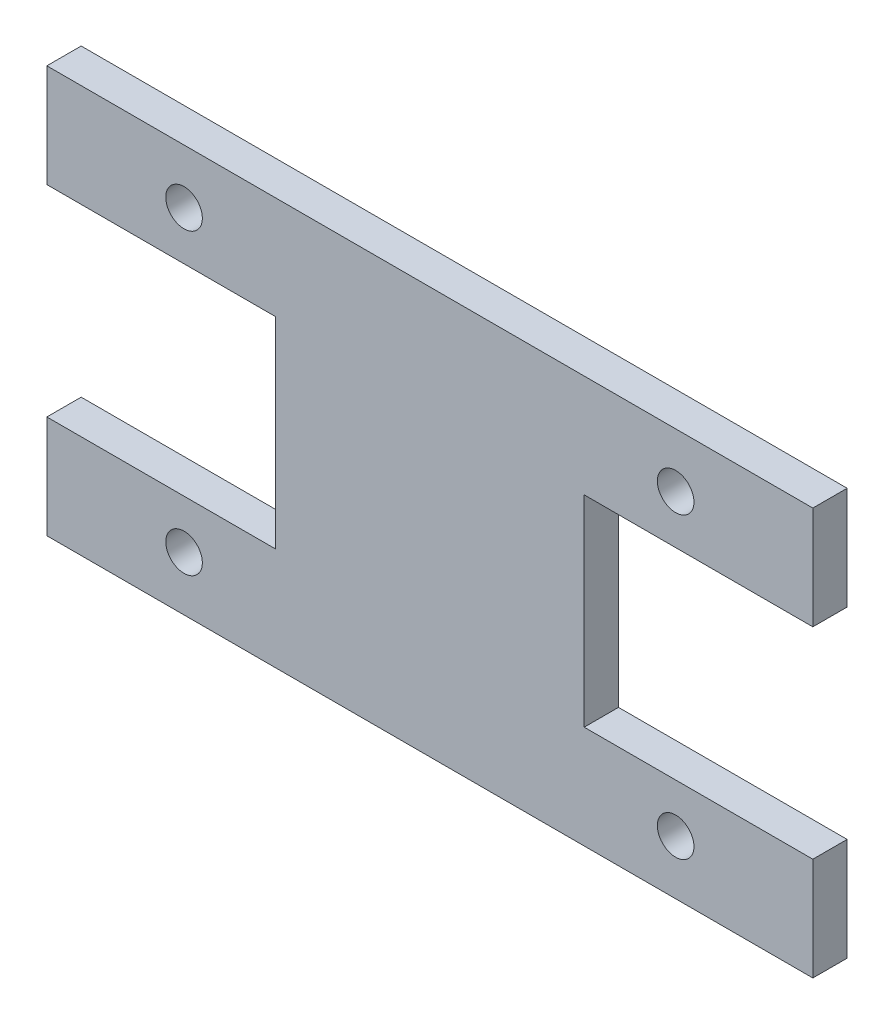
ISO-10303-21;
HEADER;
FILE_DESCRIPTION(('STEP AP214'),'2;1');
FILE_NAME('part.step','',(''),(''),'','','');
FILE_SCHEMA(('AUTOMOTIVE_DESIGN { 1 0 10303 214 1 1 1 1 }'));
ENDSEC;
DATA;
#1=APPLICATION_CONTEXT('core data for automotive mechanical design processes');
#2=APPLICATION_PROTOCOL_DEFINITION('international standard','automotive_design',2000,#1);
#3=PRODUCT_CONTEXT('',#1,'mechanical');
#4=PRODUCT('Part','Part','',(#3));
#5=PRODUCT_RELATED_PRODUCT_CATEGORY('part','',(#4));
#6=PRODUCT_DEFINITION_FORMATION('','',#4);
#7=PRODUCT_DEFINITION_CONTEXT('part definition',#1,'design');
#8=PRODUCT_DEFINITION('design','',#6,#7);
#9=PRODUCT_DEFINITION_SHAPE('','',#8);
#10=(LENGTH_UNIT() NAMED_UNIT(*) SI_UNIT(.MILLI.,.METRE.));
#11=(NAMED_UNIT(*) PLANE_ANGLE_UNIT() SI_UNIT($,.RADIAN.));
#12=(NAMED_UNIT(*) SI_UNIT($,.STERADIAN.) SOLID_ANGLE_UNIT());
#13=UNCERTAINTY_MEASURE_WITH_UNIT(LENGTH_MEASURE(1.E-05),#10,'distance_accuracy_value','');
#14=(GEOMETRIC_REPRESENTATION_CONTEXT(3) GLOBAL_UNCERTAINTY_ASSIGNED_CONTEXT((#13)) GLOBAL_UNIT_ASSIGNED_CONTEXT((#10,
#11,#12)) REPRESENTATION_CONTEXT('',''));
#15=CARTESIAN_POINT('',(0.,0.,0.));
#16=DIRECTION('',(0.,0.,1.));
#17=DIRECTION('',(1.,0.,0.));
#18=AXIS2_PLACEMENT_3D('',#15,#16,#17);
#19=CARTESIAN_POINT('',(0.,0.,3.));
#20=DIRECTION('',(0.,0.,1.));
#21=DIRECTION('',(1.,0.,0.));
#22=AXIS2_PLACEMENT_3D('',#19,#20,#21);
#23=PLANE('',#22);
#24=CARTESIAN_POINT('',(-99.9999999999991,4.75000000001644,3.));
#25=DIRECTION('',(0.,0.,1.));
#26=DIRECTION('',(1.,0.,0.));
#27=AXIS2_PLACEMENT_3D('',#24,#25,#26);
#28=CIRCLE('',#27,1.59999999999999);
#29=CARTESIAN_POINT('',(-98.3999999999992,4.75000000001644,3.));
#30=VERTEX_POINT('',#29);
#31=EDGE_CURVE('E293',#30,#30,#28,.T.);
#32=ORIENTED_EDGE('',*,*,#31,.F.);
#33=EDGE_LOOP('',(#32));
#34=FACE_BOUND('',#33,.T.);
#35=CARTESIAN_POINT('',(-57.,4.75000000000001,3.));
#36=DIRECTION('',(0.,0.,1.));
#37=DIRECTION('',(1.,0.,0.));
#38=AXIS2_PLACEMENT_3D('',#35,#36,#37);
#39=CIRCLE('',#38,1.6);
#40=CARTESIAN_POINT('',(-55.4,4.75000000000001,3.));
#41=VERTEX_POINT('',#40);
#42=EDGE_CURVE('E160',#41,#41,#39,.T.);
#43=ORIENTED_EDGE('',*,*,#42,.F.);
#44=EDGE_LOOP('',(#43));
#45=FACE_BOUND('',#44,.T.);
#46=DIRECTION('',(1.,-2.45003333381238E-13,0.));
#47=VECTOR('',#46,1.);
#48=CARTESIAN_POINT('',(-111.999999999999,1.64291273329466E-11,3.));
#49=LINE('',#48,#47);
#50=CARTESIAN_POINT('',(-111.999999999999,1.64291273329466E-11,3.));
#51=VERTEX_POINT('',#50);
#52=CARTESIAN_POINT('',(-45.,0.,3.));
#53=VERTEX_POINT('',#52);
#54=EDGE_CURVE('E179',#51,#53,#49,.T.);
#55=ORIENTED_EDGE('',*,*,#54,.T.);
#56=DIRECTION('',(0.,1.,0.));
#57=VECTOR('',#56,1.);
#58=CARTESIAN_POINT('',(-45.,0.,3.));
#59=LINE('',#58,#57);
#60=CARTESIAN_POINT('',(-45.,8.99999999999911,3.));
#61=VERTEX_POINT('',#60);
#62=EDGE_CURVE('E107',#53,#61,#59,.T.);
#63=ORIENTED_EDGE('',*,*,#62,.T.);
#64=DIRECTION('',(-1.,0.,0.));
#65=VECTOR('',#64,1.);
#66=CARTESIAN_POINT('',(-45.,8.99999999999911,3.));
#67=LINE('',#66,#65);
#68=CARTESIAN_POINT('',(-65.,8.99999999999911,3.));
#69=VERTEX_POINT('',#68);
#70=EDGE_CURVE('E206',#61,#69,#67,.T.);
#71=ORIENTED_EDGE('',*,*,#70,.T.);
#72=DIRECTION('',(0.,1.,0.));
#73=VECTOR('',#72,1.);
#74=CARTESIAN_POINT('',(-65.,8.99999999999911,3.));
#75=LINE('',#74,#73);
#76=CARTESIAN_POINT('',(-65.,26.5999999999991,3.));
#77=VERTEX_POINT('',#76);
#78=EDGE_CURVE('E225',#69,#77,#75,.T.);
#79=ORIENTED_EDGE('',*,*,#78,.T.);
#80=DIRECTION('',(1.,0.,0.));
#81=VECTOR('',#80,1.);
#82=CARTESIAN_POINT('',(-65.,26.5999999999991,3.));
#83=LINE('',#82,#81);
#84=CARTESIAN_POINT('',(-45.,26.5999999999991,3.));
#85=VERTEX_POINT('',#84);
#86=EDGE_CURVE('E222',#77,#85,#83,.T.);
#87=ORIENTED_EDGE('',*,*,#86,.T.);
#88=DIRECTION('',(0.,1.,0.));
#89=VECTOR('',#88,1.);
#90=CARTESIAN_POINT('',(-45.,26.5999999999991,3.));
#91=LINE('',#90,#89);
#92=CARTESIAN_POINT('',(-45.,35.6,3.));
#93=VERTEX_POINT('',#92);
#94=EDGE_CURVE('E224',#85,#93,#91,.T.);
#95=ORIENTED_EDGE('',*,*,#94,.T.);
#96=DIRECTION('',(-1.,2.45036163830518E-13,0.));
#97=VECTOR('',#96,1.);
#98=CARTESIAN_POINT('',(-45.,35.6,3.));
#99=LINE('',#98,#97);
#100=CARTESIAN_POINT('',(-111.999999999999,35.6000000000164,3.));
#101=VERTEX_POINT('',#100);
#102=EDGE_CURVE('E227',#93,#101,#99,.T.);
#103=ORIENTED_EDGE('',*,*,#102,.T.);
#104=DIRECTION('',(0.,-1.,0.));
#105=VECTOR('',#104,1.);
#106=CARTESIAN_POINT('',(-111.999999999999,35.6000000000164,3.));
#107=LINE('',#106,#105);
#108=CARTESIAN_POINT('',(-111.999999999999,26.5999999999991,3.));
#109=VERTEX_POINT('',#108);
#110=EDGE_CURVE('E233',#101,#109,#107,.T.);
#111=ORIENTED_EDGE('',*,*,#110,.T.);
#112=DIRECTION('',(1.,0.,0.));
#113=VECTOR('',#112,1.);
#114=CARTESIAN_POINT('',(-91.9999999999991,26.5999999999991,3.));
#115=LINE('',#114,#113);
#116=CARTESIAN_POINT('',(-91.9999999999991,26.5999999999991,3.));
#117=VERTEX_POINT('',#116);
#118=EDGE_CURVE('E138',#109,#117,#115,.T.);
#119=ORIENTED_EDGE('',*,*,#118,.T.);
#120=DIRECTION('',(0.,-1.,0.));
#121=VECTOR('',#120,1.);
#122=CARTESIAN_POINT('',(-91.9999999999991,9.00000000001643,3.));
#123=LINE('',#122,#121);
#124=CARTESIAN_POINT('',(-91.9999999999991,9.00000000001643,3.));
#125=VERTEX_POINT('',#124);
#126=EDGE_CURVE('E132',#117,#125,#123,.T.);
#127=ORIENTED_EDGE('',*,*,#126,.T.);
#128=DIRECTION('',(-1.,0.,0.));
#129=VECTOR('',#128,1.);
#130=CARTESIAN_POINT('',(-111.999999999999,9.00000000001643,3.));
#131=LINE('',#130,#129);
#132=CARTESIAN_POINT('',(-111.999999999999,9.00000000001643,3.));
#133=VERTEX_POINT('',#132);
#134=EDGE_CURVE('E136',#125,#133,#131,.T.);
#135=ORIENTED_EDGE('',*,*,#134,.T.);
#136=DIRECTION('',(0.,-1.,0.));
#137=VECTOR('',#136,1.);
#138=CARTESIAN_POINT('',(-111.999999999999,9.00000000001643,3.));
#139=LINE('',#138,#137);
#140=EDGE_CURVE('E52',#133,#51,#139,.T.);
#141=ORIENTED_EDGE('',*,*,#140,.T.);
#142=EDGE_LOOP('',(#55,#63,#71,#79,#87,#95,#103,#111,#119,#127,#135,#141));
#143=FACE_BOUND('',#142,.T.);
#144=CARTESIAN_POINT('',(-57.,30.85,3.));
#145=DIRECTION('',(0.,0.,1.));
#146=DIRECTION('',(1.,0.,0.));
#147=AXIS2_PLACEMENT_3D('',#144,#145,#146);
#148=CIRCLE('',#147,1.6);
#149=CARTESIAN_POINT('',(-55.4,30.85,3.));
#150=VERTEX_POINT('',#149);
#151=EDGE_CURVE('E299',#150,#150,#148,.T.);
#152=ORIENTED_EDGE('',*,*,#151,.F.);
#153=EDGE_LOOP('',(#152));
#154=FACE_BOUND('',#153,.T.);
#155=CARTESIAN_POINT('',(-99.9999999999991,30.8500000000164,3.));
#156=DIRECTION('',(0.,0.,1.));
#157=DIRECTION('',(1.,0.,0.));
#158=AXIS2_PLACEMENT_3D('',#155,#156,#157);
#159=CIRCLE('',#158,1.59999999999999);
#160=CARTESIAN_POINT('',(-98.3999999999992,30.8500000000164,3.));
#161=VERTEX_POINT('',#160);
#162=EDGE_CURVE('E284',#161,#161,#159,.T.);
#163=ORIENTED_EDGE('',*,*,#162,.F.);
#164=EDGE_LOOP('',(#163));
#165=FACE_BOUND('',#164,.T.);
#166=ADVANCED_FACE('F35',(#34,#45,#143,#154,#165),#23,.T.);
#167=CARTESIAN_POINT('',(0.,0.,0.));
#168=DIRECTION('',(0.,0.,1.));
#169=DIRECTION('',(1.,0.,0.));
#170=AXIS2_PLACEMENT_3D('',#167,#168,#169);
#171=PLANE('',#170);
#172=DIRECTION('',(1.,-2.45003333381238E-13,0.));
#173=VECTOR('',#172,1.);
#174=CARTESIAN_POINT('',(-111.999999999999,1.64291273329466E-11,0.));
#175=LINE('',#174,#173);
#176=CARTESIAN_POINT('',(-111.999999999999,1.64291273329466E-11,0.));
#177=VERTEX_POINT('',#176);
#178=CARTESIAN_POINT('',(-45.,0.,0.));
#179=VERTEX_POINT('',#178);
#180=EDGE_CURVE('E156',#177,#179,#175,.T.);
#181=ORIENTED_EDGE('',*,*,#180,.F.);
#182=DIRECTION('',(0.,-1.,0.));
#183=VECTOR('',#182,1.);
#184=CARTESIAN_POINT('',(-111.999999999999,9.00000000001643,0.));
#185=LINE('',#184,#183);
#186=CARTESIAN_POINT('',(-111.999999999999,9.00000000001643,0.));
#187=VERTEX_POINT('',#186);
#188=EDGE_CURVE('E99',#187,#177,#185,.T.);
#189=ORIENTED_EDGE('',*,*,#188,.F.);
#190=DIRECTION('',(-1.,0.,0.));
#191=VECTOR('',#190,1.);
#192=CARTESIAN_POINT('',(-111.999999999999,9.00000000001643,0.));
#193=LINE('',#192,#191);
#194=CARTESIAN_POINT('',(-91.9999999999991,9.00000000001643,0.));
#195=VERTEX_POINT('',#194);
#196=EDGE_CURVE('E93',#195,#187,#193,.T.);
#197=ORIENTED_EDGE('',*,*,#196,.F.);
#198=DIRECTION('',(0.,-1.,0.));
#199=VECTOR('',#198,1.);
#200=CARTESIAN_POINT('',(-91.9999999999991,9.00000000001643,0.));
#201=LINE('',#200,#199);
#202=CARTESIAN_POINT('',(-91.9999999999991,26.5999999999991,0.));
#203=VERTEX_POINT('',#202);
#204=EDGE_CURVE('E146',#203,#195,#201,.T.);
#205=ORIENTED_EDGE('',*,*,#204,.F.);
#206=DIRECTION('',(1.,0.,0.));
#207=VECTOR('',#206,1.);
#208=CARTESIAN_POINT('',(-91.9999999999991,26.5999999999991,0.));
#209=LINE('',#208,#207);
#210=CARTESIAN_POINT('',(-111.999999999999,26.5999999999991,0.));
#211=VERTEX_POINT('',#210);
#212=EDGE_CURVE('E174',#211,#203,#209,.T.);
#213=ORIENTED_EDGE('',*,*,#212,.F.);
#214=DIRECTION('',(0.,-1.,0.));
#215=VECTOR('',#214,1.);
#216=CARTESIAN_POINT('',(-111.999999999999,35.6000000000164,0.));
#217=LINE('',#216,#215);
#218=CARTESIAN_POINT('',(-111.999999999999,35.6000000000164,0.));
#219=VERTEX_POINT('',#218);
#220=EDGE_CURVE('E172',#219,#211,#217,.T.);
#221=ORIENTED_EDGE('',*,*,#220,.F.);
#222=DIRECTION('',(-1.,2.45036163830518E-13,0.));
#223=VECTOR('',#222,1.);
#224=CARTESIAN_POINT('',(-45.,35.6,0.));
#225=LINE('',#224,#223);
#226=CARTESIAN_POINT('',(-45.,35.6,0.));
#227=VERTEX_POINT('',#226);
#228=EDGE_CURVE('E170',#227,#219,#225,.T.);
#229=ORIENTED_EDGE('',*,*,#228,.F.);
#230=DIRECTION('',(0.,1.,0.));
#231=VECTOR('',#230,1.);
#232=CARTESIAN_POINT('',(-45.,26.5999999999991,0.));
#233=LINE('',#232,#231);
#234=CARTESIAN_POINT('',(-45.,26.5999999999991,0.));
#235=VERTEX_POINT('',#234);
#236=EDGE_CURVE('E168',#235,#227,#233,.T.);
#237=ORIENTED_EDGE('',*,*,#236,.F.);
#238=DIRECTION('',(1.,0.,0.));
#239=VECTOR('',#238,1.);
#240=CARTESIAN_POINT('',(-65.,26.5999999999991,0.));
#241=LINE('',#240,#239);
#242=CARTESIAN_POINT('',(-65.,26.5999999999991,0.));
#243=VERTEX_POINT('',#242);
#244=EDGE_CURVE('E166',#243,#235,#241,.T.);
#245=ORIENTED_EDGE('',*,*,#244,.F.);
#246=DIRECTION('',(0.,1.,0.));
#247=VECTOR('',#246,1.);
#248=CARTESIAN_POINT('',(-65.,8.99999999999911,0.));
#249=LINE('',#248,#247);
#250=CARTESIAN_POINT('',(-65.,8.99999999999911,0.));
#251=VERTEX_POINT('',#250);
#252=EDGE_CURVE('E164',#251,#243,#249,.T.);
#253=ORIENTED_EDGE('',*,*,#252,.F.);
#254=DIRECTION('',(-1.,0.,0.));
#255=VECTOR('',#254,1.);
#256=CARTESIAN_POINT('',(-45.,8.99999999999911,0.));
#257=LINE('',#256,#255);
#258=CARTESIAN_POINT('',(-45.,8.99999999999911,0.));
#259=VERTEX_POINT('',#258);
#260=EDGE_CURVE('E162',#259,#251,#257,.T.);
#261=ORIENTED_EDGE('',*,*,#260,.F.);
#262=DIRECTION('',(0.,1.,0.));
#263=VECTOR('',#262,1.);
#264=CARTESIAN_POINT('',(-45.,0.,0.));
#265=LINE('',#264,#263);
#266=EDGE_CURVE('E159',#179,#259,#265,.T.);
#267=ORIENTED_EDGE('',*,*,#266,.F.);
#268=EDGE_LOOP('',(#181,#189,#197,#205,#213,#221,#229,#237,#245,#253,#261,#267));
#269=FACE_BOUND('',#268,.T.);
#270=CARTESIAN_POINT('',(-57.,4.75000000000001,0.));
#271=DIRECTION('',(0.,0.,1.));
#272=DIRECTION('',(1.,0.,0.));
#273=AXIS2_PLACEMENT_3D('',#270,#271,#272);
#274=CIRCLE('',#273,1.6);
#275=CARTESIAN_POINT('',(-55.4,4.75000000000001,0.));
#276=VERTEX_POINT('',#275);
#277=EDGE_CURVE('E302',#276,#276,#274,.T.);
#278=ORIENTED_EDGE('',*,*,#277,.T.);
#279=EDGE_LOOP('',(#278));
#280=FACE_BOUND('',#279,.T.);
#281=CARTESIAN_POINT('',(-57.,30.85,0.));
#282=DIRECTION('',(0.,0.,1.));
#283=DIRECTION('',(1.,0.,0.));
#284=AXIS2_PLACEMENT_3D('',#281,#282,#283);
#285=CIRCLE('',#284,1.6);
#286=CARTESIAN_POINT('',(-55.4,30.85,0.));
#287=VERTEX_POINT('',#286);
#288=EDGE_CURVE('E296',#287,#287,#285,.T.);
#289=ORIENTED_EDGE('',*,*,#288,.T.);
#290=EDGE_LOOP('',(#289));
#291=FACE_BOUND('',#290,.T.);
#292=CARTESIAN_POINT('',(-99.9999999999991,4.75000000001644,0.));
#293=DIRECTION('',(0.,0.,1.));
#294=DIRECTION('',(1.,0.,0.));
#295=AXIS2_PLACEMENT_3D('',#292,#293,#294);
#296=CIRCLE('',#295,1.59999999999999);
#297=CARTESIAN_POINT('',(-98.3999999999992,4.75000000001644,0.));
#298=VERTEX_POINT('',#297);
#299=EDGE_CURVE('E290',#298,#298,#296,.T.);
#300=ORIENTED_EDGE('',*,*,#299,.T.);
#301=EDGE_LOOP('',(#300));
#302=FACE_BOUND('',#301,.T.);
#303=CARTESIAN_POINT('',(-99.9999999999991,30.8500000000164,0.));
#304=DIRECTION('',(0.,0.,1.));
#305=DIRECTION('',(1.,0.,0.));
#306=AXIS2_PLACEMENT_3D('',#303,#304,#305);
#307=CIRCLE('',#306,1.59999999999999);
#308=CARTESIAN_POINT('',(-98.3999999999992,30.8500000000164,0.));
#309=VERTEX_POINT('',#308);
#310=EDGE_CURVE('E287',#309,#309,#307,.T.);
#311=ORIENTED_EDGE('',*,*,#310,.T.);
#312=EDGE_LOOP('',(#311));
#313=FACE_BOUND('',#312,.T.);
#314=ADVANCED_FACE('F210',(#269,#280,#291,#302,#313),#171,.F.);
#315=CARTESIAN_POINT('',(-111.999999999999,1.64291273329466E-11,3.));
#316=DIRECTION('',(2.45003333381238E-13,1.,0.));
#317=DIRECTION('',(-1.,2.45003333381238E-13,0.));
#318=AXIS2_PLACEMENT_3D('',#315,#316,#317);
#319=PLANE('',#318);
#320=ORIENTED_EDGE('',*,*,#180,.T.);
#321=DIRECTION('',(0.,0.,-1.));
#322=VECTOR('',#321,1.);
#323=CARTESIAN_POINT('',(-45.,0.,3.));
#324=LINE('',#323,#322);
#325=EDGE_CURVE('E11',#53,#179,#324,.T.);
#326=ORIENTED_EDGE('',*,*,#325,.F.);
#327=ORIENTED_EDGE('',*,*,#54,.F.);
#328=DIRECTION('',(0.,0.,-1.));
#329=VECTOR('',#328,1.);
#330=CARTESIAN_POINT('',(-111.999999999999,1.64291273329466E-11,3.));
#331=LINE('',#330,#329);
#332=EDGE_CURVE('E152',#51,#177,#331,.T.);
#333=ORIENTED_EDGE('',*,*,#332,.T.);
#334=EDGE_LOOP('',(#320,#326,#327,#333));
#335=FACE_BOUND('',#334,.T.);
#336=ADVANCED_FACE('F37',(#335),#319,.F.);
#337=CARTESIAN_POINT('',(-45.,0.,3.));
#338=DIRECTION('',(-1.,0.,0.));
#339=DIRECTION('',(0.,0.,1.));
#340=AXIS2_PLACEMENT_3D('',#337,#338,#339);
#341=PLANE('',#340);
#342=ORIENTED_EDGE('',*,*,#266,.T.);
#343=DIRECTION('',(0.,0.,-1.));
#344=VECTOR('',#343,1.);
#345=CARTESIAN_POINT('',(-45.,8.99999999999911,3.));
#346=LINE('',#345,#344);
#347=EDGE_CURVE('E44',#61,#259,#346,.T.);
#348=ORIENTED_EDGE('',*,*,#347,.F.);
#349=ORIENTED_EDGE('',*,*,#62,.F.);
#350=ORIENTED_EDGE('',*,*,#325,.T.);
#351=EDGE_LOOP('',(#342,#348,#349,#350));
#352=FACE_BOUND('',#351,.T.);
#353=ADVANCED_FACE('F412',(#352),#341,.F.);
#354=CARTESIAN_POINT('',(-45.,8.99999999999911,3.));
#355=DIRECTION('',(0.,-1.,0.));
#356=DIRECTION('',(1.,0.,0.));
#357=AXIS2_PLACEMENT_3D('',#354,#355,#356);
#358=PLANE('',#357);
#359=ORIENTED_EDGE('',*,*,#260,.T.);
#360=DIRECTION('',(0.,0.,-1.));
#361=VECTOR('',#360,1.);
#362=CARTESIAN_POINT('',(-65.,8.99999999999911,3.));
#363=LINE('',#362,#361);
#364=EDGE_CURVE('E198',#69,#251,#363,.T.);
#365=ORIENTED_EDGE('',*,*,#364,.F.);
#366=ORIENTED_EDGE('',*,*,#70,.F.);
#367=ORIENTED_EDGE('',*,*,#347,.T.);
#368=EDGE_LOOP('',(#359,#365,#366,#367));
#369=FACE_BOUND('',#368,.T.);
#370=ADVANCED_FACE('F204',(#369),#358,.F.);
#371=CARTESIAN_POINT('',(-65.,8.99999999999911,3.));
#372=DIRECTION('',(-1.,0.,0.));
#373=DIRECTION('',(0.,0.,1.));
#374=AXIS2_PLACEMENT_3D('',#371,#372,#373);
#375=PLANE('',#374);
#376=ORIENTED_EDGE('',*,*,#252,.T.);
#377=DIRECTION('',(0.,0.,-1.));
#378=VECTOR('',#377,1.);
#379=CARTESIAN_POINT('',(-65.,26.5999999999991,3.));
#380=LINE('',#379,#378);
#381=EDGE_CURVE('E195',#77,#243,#380,.T.);
#382=ORIENTED_EDGE('',*,*,#381,.F.);
#383=ORIENTED_EDGE('',*,*,#78,.F.);
#384=ORIENTED_EDGE('',*,*,#364,.T.);
#385=EDGE_LOOP('',(#376,#382,#383,#384));
#386=FACE_BOUND('',#385,.T.);
#387=ADVANCED_FACE('F216',(#386),#375,.F.);
#388=CARTESIAN_POINT('',(-65.,26.5999999999991,3.));
#389=DIRECTION('',(0.,1.,0.));
#390=DIRECTION('',(0.,0.,1.));
#391=AXIS2_PLACEMENT_3D('',#388,#389,#390);
#392=PLANE('',#391);
#393=ORIENTED_EDGE('',*,*,#244,.T.);
#394=DIRECTION('',(0.,0.,-1.));
#395=VECTOR('',#394,1.);
#396=CARTESIAN_POINT('',(-45.,26.5999999999991,3.));
#397=LINE('',#396,#395);
#398=EDGE_CURVE('E192',#85,#235,#397,.T.);
#399=ORIENTED_EDGE('',*,*,#398,.F.);
#400=ORIENTED_EDGE('',*,*,#86,.F.);
#401=ORIENTED_EDGE('',*,*,#381,.T.);
#402=EDGE_LOOP('',(#393,#399,#400,#401));
#403=FACE_BOUND('',#402,.T.);
#404=ADVANCED_FACE('F220',(#403),#392,.F.);
#405=CARTESIAN_POINT('',(-45.,26.5999999999991,3.));
#406=DIRECTION('',(-1.,0.,0.));
#407=DIRECTION('',(0.,-1.,0.));
#408=AXIS2_PLACEMENT_3D('',#405,#406,#407);
#409=PLANE('',#408);
#410=ORIENTED_EDGE('',*,*,#236,.T.);
#411=DIRECTION('',(0.,0.,-1.));
#412=VECTOR('',#411,1.);
#413=CARTESIAN_POINT('',(-45.,35.6,3.));
#414=LINE('',#413,#412);
#415=EDGE_CURVE('E189',#93,#227,#414,.T.);
#416=ORIENTED_EDGE('',*,*,#415,.F.);
#417=ORIENTED_EDGE('',*,*,#94,.F.);
#418=ORIENTED_EDGE('',*,*,#398,.T.);
#419=EDGE_LOOP('',(#410,#416,#417,#418));
#420=FACE_BOUND('',#419,.T.);
#421=ADVANCED_FACE('F377',(#420),#409,.F.);
#422=CARTESIAN_POINT('',(-45.,35.6,3.));
#423=DIRECTION('',(-2.45036163830518E-13,-1.,0.));
#424=DIRECTION('',(1.,-2.45036163830518E-13,0.));
#425=AXIS2_PLACEMENT_3D('',#422,#423,#424);
#426=PLANE('',#425);
#427=ORIENTED_EDGE('',*,*,#228,.T.);
#428=DIRECTION('',(0.,0.,-1.));
#429=VECTOR('',#428,1.);
#430=CARTESIAN_POINT('',(-111.999999999999,35.6000000000164,3.));
#431=LINE('',#430,#429);
#432=EDGE_CURVE('E186',#101,#219,#431,.T.);
#433=ORIENTED_EDGE('',*,*,#432,.F.);
#434=ORIENTED_EDGE('',*,*,#102,.F.);
#435=ORIENTED_EDGE('',*,*,#415,.T.);
#436=EDGE_LOOP('',(#427,#433,#434,#435));
#437=FACE_BOUND('',#436,.T.);
#438=ADVANCED_FACE('F368',(#437),#426,.F.);
#439=CARTESIAN_POINT('',(-111.999999999999,35.6000000000164,3.));
#440=DIRECTION('',(1.,0.,0.));
#441=DIRECTION('',(0.,0.,-1.));
#442=AXIS2_PLACEMENT_3D('',#439,#440,#441);
#443=PLANE('',#442);
#444=ORIENTED_EDGE('',*,*,#220,.T.);
#445=DIRECTION('',(0.,0.,-1.));
#446=VECTOR('',#445,1.);
#447=CARTESIAN_POINT('',(-111.999999999999,26.5999999999991,3.));
#448=LINE('',#447,#446);
#449=EDGE_CURVE('E183',#109,#211,#448,.T.);
#450=ORIENTED_EDGE('',*,*,#449,.F.);
#451=ORIENTED_EDGE('',*,*,#110,.F.);
#452=ORIENTED_EDGE('',*,*,#432,.T.);
#453=EDGE_LOOP('',(#444,#450,#451,#452));
#454=FACE_BOUND('',#453,.T.);
#455=ADVANCED_FACE('F239',(#454),#443,.F.);
#456=CARTESIAN_POINT('',(-91.9999999999991,26.5999999999991,3.));
#457=DIRECTION('',(0.,1.,0.));
#458=DIRECTION('',(0.,0.,1.));
#459=AXIS2_PLACEMENT_3D('',#456,#457,#458);
#460=PLANE('',#459);
#461=ORIENTED_EDGE('',*,*,#212,.T.);
#462=DIRECTION('',(0.,0.,-1.));
#463=VECTOR('',#462,1.);
#464=CARTESIAN_POINT('',(-91.9999999999991,26.5999999999991,3.));
#465=LINE('',#464,#463);
#466=EDGE_CURVE('E147',#117,#203,#465,.T.);
#467=ORIENTED_EDGE('',*,*,#466,.F.);
#468=ORIENTED_EDGE('',*,*,#118,.F.);
#469=ORIENTED_EDGE('',*,*,#449,.T.);
#470=EDGE_LOOP('',(#461,#467,#468,#469));
#471=FACE_BOUND('',#470,.T.);
#472=ADVANCED_FACE('F243',(#471),#460,.F.);
#473=CARTESIAN_POINT('',(-91.9999999999991,9.00000000001643,3.));
#474=DIRECTION('',(1.,0.,0.));
#475=DIRECTION('',(0.,0.,-1.));
#476=AXIS2_PLACEMENT_3D('',#473,#474,#475);
#477=PLANE('',#476);
#478=ORIENTED_EDGE('',*,*,#204,.T.);
#479=DIRECTION('',(0.,0.,-1.));
#480=VECTOR('',#479,1.);
#481=CARTESIAN_POINT('',(-91.9999999999991,9.00000000001643,3.));
#482=LINE('',#481,#480);
#483=EDGE_CURVE('E143',#125,#195,#482,.T.);
#484=ORIENTED_EDGE('',*,*,#483,.F.);
#485=ORIENTED_EDGE('',*,*,#126,.F.);
#486=ORIENTED_EDGE('',*,*,#466,.T.);
#487=EDGE_LOOP('',(#478,#484,#485,#486));
#488=FACE_BOUND('',#487,.T.);
#489=ADVANCED_FACE('F144',(#488),#477,.F.);
#490=CARTESIAN_POINT('',(-111.999999999999,9.00000000001643,3.));
#491=DIRECTION('',(0.,-1.,0.));
#492=DIRECTION('',(0.,0.,-1.));
#493=AXIS2_PLACEMENT_3D('',#490,#491,#492);
#494=PLANE('',#493);
#495=ORIENTED_EDGE('',*,*,#196,.T.);
#496=DIRECTION('',(0.,0.,-1.));
#497=VECTOR('',#496,1.);
#498=CARTESIAN_POINT('',(-111.999999999999,9.00000000001643,3.));
#499=LINE('',#498,#497);
#500=EDGE_CURVE('E148',#133,#187,#499,.T.);
#501=ORIENTED_EDGE('',*,*,#500,.F.);
#502=ORIENTED_EDGE('',*,*,#134,.F.);
#503=ORIENTED_EDGE('',*,*,#483,.T.);
#504=EDGE_LOOP('',(#495,#501,#502,#503));
#505=FACE_BOUND('',#504,.T.);
#506=ADVANCED_FACE('F150',(#505),#494,.F.);
#507=CARTESIAN_POINT('',(-111.999999999999,9.00000000001643,3.));
#508=DIRECTION('',(1.,0.,0.));
#509=DIRECTION('',(0.,1.,0.));
#510=AXIS2_PLACEMENT_3D('',#507,#508,#509);
#511=PLANE('',#510);
#512=ORIENTED_EDGE('',*,*,#188,.T.);
#513=ORIENTED_EDGE('',*,*,#332,.F.);
#514=ORIENTED_EDGE('',*,*,#140,.F.);
#515=ORIENTED_EDGE('',*,*,#500,.T.);
#516=EDGE_LOOP('',(#512,#513,#514,#515));
#517=FACE_BOUND('',#516,.T.);
#518=ADVANCED_FACE('F247',(#517),#511,.F.);
#519=CARTESIAN_POINT('',(-57.,4.75000000000001,3.));
#520=DIRECTION('',(0.,0.,-1.));
#521=DIRECTION('',(-1.,0.,0.));
#522=AXIS2_PLACEMENT_3D('',#519,#520,#521);
#523=CYLINDRICAL_SURFACE('',#522,1.6);
#524=ORIENTED_EDGE('',*,*,#42,.T.);
#525=EDGE_LOOP('',(#524));
#526=FACE_BOUND('',#525,.T.);
#527=ORIENTED_EDGE('',*,*,#277,.F.);
#528=EDGE_LOOP('',(#527));
#529=FACE_BOUND('',#528,.T.);
#530=ADVANCED_FACE('F249',(#526,#529),#523,.F.);
#531=CARTESIAN_POINT('',(-57.,30.85,3.));
#532=DIRECTION('',(0.,0.,-1.));
#533=DIRECTION('',(-1.,0.,0.));
#534=AXIS2_PLACEMENT_3D('',#531,#532,#533);
#535=CYLINDRICAL_SURFACE('',#534,1.6);
#536=ORIENTED_EDGE('',*,*,#151,.T.);
#537=EDGE_LOOP('',(#536));
#538=FACE_BOUND('',#537,.T.);
#539=ORIENTED_EDGE('',*,*,#288,.F.);
#540=EDGE_LOOP('',(#539));
#541=FACE_BOUND('',#540,.T.);
#542=ADVANCED_FACE('F255',(#538,#541),#535,.F.);
#543=CARTESIAN_POINT('',(-99.9999999999991,4.75000000001644,3.));
#544=DIRECTION('',(0.,0.,-1.));
#545=DIRECTION('',(-1.,0.,0.));
#546=AXIS2_PLACEMENT_3D('',#543,#544,#545);
#547=CYLINDRICAL_SURFACE('',#546,1.59999999999999);
#548=ORIENTED_EDGE('',*,*,#31,.T.);
#549=EDGE_LOOP('',(#548));
#550=FACE_BOUND('',#549,.T.);
#551=ORIENTED_EDGE('',*,*,#299,.F.);
#552=EDGE_LOOP('',(#551));
#553=FACE_BOUND('',#552,.T.);
#554=ADVANCED_FACE('F271',(#550,#553),#547,.F.);
#555=CARTESIAN_POINT('',(-99.9999999999991,30.8500000000164,3.));
#556=DIRECTION('',(0.,0.,-1.));
#557=DIRECTION('',(-1.,0.,0.));
#558=AXIS2_PLACEMENT_3D('',#555,#556,#557);
#559=CYLINDRICAL_SURFACE('',#558,1.59999999999999);
#560=ORIENTED_EDGE('',*,*,#162,.T.);
#561=EDGE_LOOP('',(#560));
#562=FACE_BOUND('',#561,.T.);
#563=ORIENTED_EDGE('',*,*,#310,.F.);
#564=EDGE_LOOP('',(#563));
#565=FACE_BOUND('',#564,.T.);
#566=ADVANCED_FACE('F275',(#562,#565),#559,.F.);
#567=CLOSED_SHELL('',(#166,#314,#336,#353,#370,#387,#404,#421,#438,#455,#472,#489,#506,#518,
#530,#542,#554,#566));
#568=MANIFOLD_SOLID_BREP('B2',#567);
#569=ADVANCED_BREP_SHAPE_REPRESENTATION('',(#18,#568),#14);
#570=SHAPE_DEFINITION_REPRESENTATION(#9,#569);
ENDSEC;
END-ISO-10303-21;
